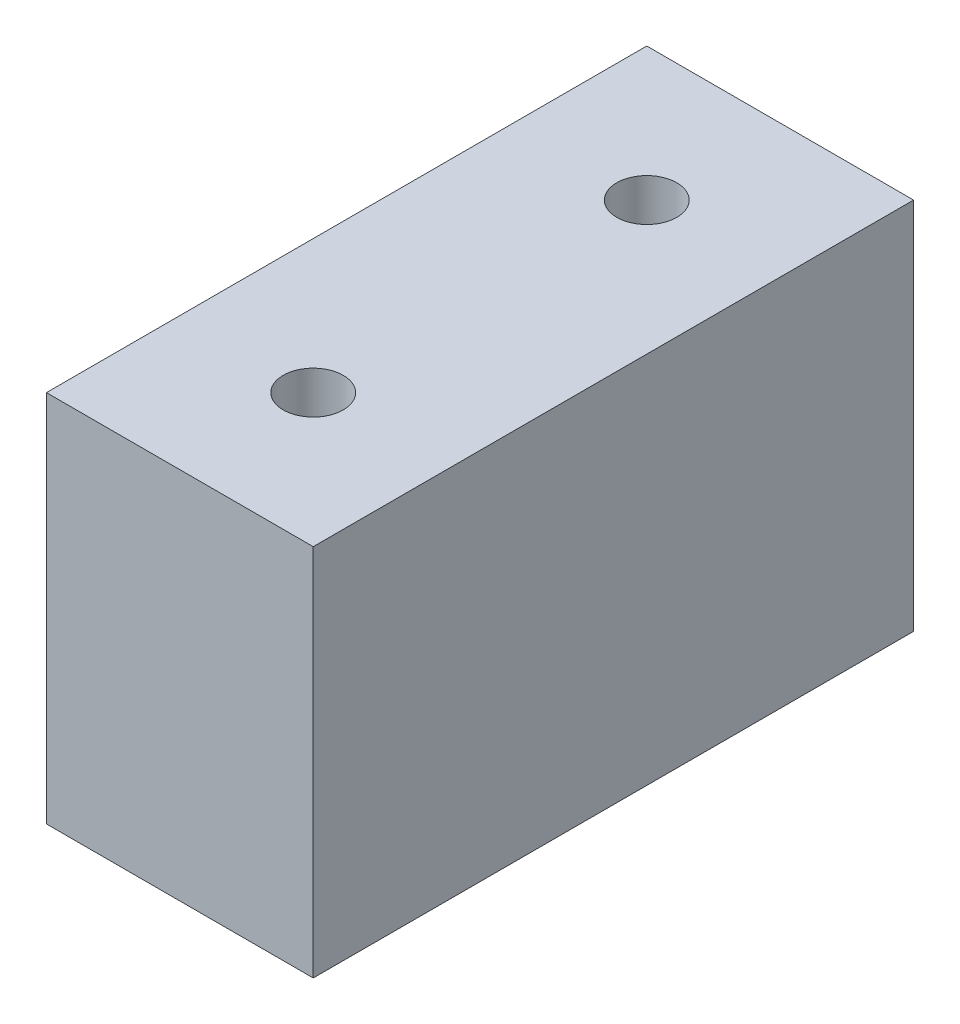
ISO-10303-21;
HEADER;
FILE_DESCRIPTION(('STEP AP214'),'2;1');
FILE_NAME('part.step','',(''),(''),'','','');
FILE_SCHEMA(('AUTOMOTIVE_DESIGN { 1 0 10303 214 1 1 1 1 }'));
ENDSEC;
DATA;
#1=APPLICATION_CONTEXT('core data for automotive mechanical design processes');
#2=APPLICATION_PROTOCOL_DEFINITION('international standard','automotive_design',2000,#1);
#3=PRODUCT_CONTEXT('',#1,'mechanical');
#4=PRODUCT('Part','Part','',(#3));
#5=PRODUCT_RELATED_PRODUCT_CATEGORY('part','',(#4));
#6=PRODUCT_DEFINITION_FORMATION('','',#4);
#7=PRODUCT_DEFINITION_CONTEXT('part definition',#1,'design');
#8=PRODUCT_DEFINITION('design','',#6,#7);
#9=PRODUCT_DEFINITION_SHAPE('','',#8);
#10=(LENGTH_UNIT() NAMED_UNIT(*) SI_UNIT(.MILLI.,.METRE.));
#11=(NAMED_UNIT(*) PLANE_ANGLE_UNIT() SI_UNIT($,.RADIAN.));
#12=(NAMED_UNIT(*) SI_UNIT($,.STERADIAN.) SOLID_ANGLE_UNIT());
#13=UNCERTAINTY_MEASURE_WITH_UNIT(LENGTH_MEASURE(1.E-05),#10,'distance_accuracy_value','');
#14=(GEOMETRIC_REPRESENTATION_CONTEXT(3) GLOBAL_UNCERTAINTY_ASSIGNED_CONTEXT((#13)) GLOBAL_UNIT_ASSIGNED_CONTEXT((#10,
#11,#12)) REPRESENTATION_CONTEXT('',''));
#15=CARTESIAN_POINT('',(0.,0.,0.));
#16=DIRECTION('',(0.,0.,1.));
#17=DIRECTION('',(1.,0.,0.));
#18=AXIS2_PLACEMENT_3D('',#15,#16,#17);
#19=CARTESIAN_POINT('',(0.,28.,0.));
#20=DIRECTION('',(0.,-1.,0.));
#21=DIRECTION('',(0.,0.,-1.));
#22=AXIS2_PLACEMENT_3D('',#19,#20,#21);
#23=PLANE('',#22);
#24=DIRECTION('',(0.,0.,1.));
#25=VECTOR('',#24,1.);
#26=CARTESIAN_POINT('',(0.,28.,0.));
#27=LINE('',#26,#25);
#28=CARTESIAN_POINT('',(0.,28.,-45.));
#29=VERTEX_POINT('',#28);
#30=CARTESIAN_POINT('',(0.,28.,0.));
#31=VERTEX_POINT('',#30);
#32=EDGE_CURVE('E91',#29,#31,#27,.T.);
#33=ORIENTED_EDGE('',*,*,#32,.T.);
#34=DIRECTION('',(1.,0.,0.));
#35=VECTOR('',#34,1.);
#36=CARTESIAN_POINT('',(0.,28.,0.));
#37=LINE('',#36,#35);
#38=CARTESIAN_POINT('',(20.,28.,0.));
#39=VERTEX_POINT('',#38);
#40=EDGE_CURVE('E86',#31,#39,#37,.T.);
#41=ORIENTED_EDGE('',*,*,#40,.T.);
#42=DIRECTION('',(0.,0.,-1.));
#43=VECTOR('',#42,1.);
#44=CARTESIAN_POINT('',(20.,28.,0.));
#45=LINE('',#44,#43);
#46=CARTESIAN_POINT('',(20.,28.,-45.));
#47=VERTEX_POINT('',#46);
#48=EDGE_CURVE('E89',#39,#47,#45,.T.);
#49=ORIENTED_EDGE('',*,*,#48,.T.);
#50=DIRECTION('',(-1.,0.,0.));
#51=VECTOR('',#50,1.);
#52=CARTESIAN_POINT('',(0.,28.,-45.));
#53=LINE('',#52,#51);
#54=EDGE_CURVE('E56',#47,#29,#53,.T.);
#55=ORIENTED_EDGE('',*,*,#54,.T.);
#56=EDGE_LOOP('',(#33,#41,#49,#55));
#57=FACE_BOUND('',#56,.T.);
#58=CARTESIAN_POINT('',(10.,28.,-35.));
#59=DIRECTION('',(0.,1.,0.));
#60=DIRECTION('',(0.,0.,1.));
#61=AXIS2_PLACEMENT_3D('',#58,#59,#60);
#62=CIRCLE('',#61,2.25);
#63=CARTESIAN_POINT('',(10.,28.,-32.75));
#64=VERTEX_POINT('',#63);
#65=EDGE_CURVE('E106',#64,#64,#62,.T.);
#66=ORIENTED_EDGE('',*,*,#65,.F.);
#67=EDGE_LOOP('',(#66));
#68=FACE_BOUND('',#67,.T.);
#69=CARTESIAN_POINT('',(10.,28.,-9.99999999999999));
#70=DIRECTION('',(0.,1.,0.));
#71=DIRECTION('',(0.,0.,-1.));
#72=AXIS2_PLACEMENT_3D('',#69,#70,#71);
#73=CIRCLE('',#72,2.25);
#74=CARTESIAN_POINT('',(10.,28.,-12.25));
#75=VERTEX_POINT('',#74);
#76=EDGE_CURVE('E121',#75,#75,#73,.T.);
#77=ORIENTED_EDGE('',*,*,#76,.F.);
#78=EDGE_LOOP('',(#77));
#79=FACE_BOUND('',#78,.T.);
#80=ADVANCED_FACE('F39',(#57,#68,#79),#23,.F.);
#81=CARTESIAN_POINT('',(0.,0.,0.));
#82=DIRECTION('',(0.,-1.,0.));
#83=DIRECTION('',(0.,0.,-1.));
#84=AXIS2_PLACEMENT_3D('',#81,#82,#83);
#85=PLANE('',#84);
#86=CARTESIAN_POINT('',(10.,0.,-35.));
#87=DIRECTION('',(0.,1.,0.));
#88=DIRECTION('',(0.,0.,1.));
#89=AXIS2_PLACEMENT_3D('',#86,#87,#88);
#90=CIRCLE('',#89,2.25);
#91=CARTESIAN_POINT('',(10.,0.,-32.75));
#92=VERTEX_POINT('',#91);
#93=EDGE_CURVE('E118',#92,#92,#90,.T.);
#94=ORIENTED_EDGE('',*,*,#93,.T.);
#95=EDGE_LOOP('',(#94));
#96=FACE_BOUND('',#95,.T.);
#97=DIRECTION('',(0.,0.,1.));
#98=VECTOR('',#97,1.);
#99=CARTESIAN_POINT('',(0.,0.,0.));
#100=LINE('',#99,#98);
#101=CARTESIAN_POINT('',(0.,0.,-45.));
#102=VERTEX_POINT('',#101);
#103=CARTESIAN_POINT('',(0.,0.,0.));
#104=VERTEX_POINT('',#103);
#105=EDGE_CURVE('E103',#102,#104,#100,.T.);
#106=ORIENTED_EDGE('',*,*,#105,.F.);
#107=DIRECTION('',(-1.,0.,0.));
#108=VECTOR('',#107,1.);
#109=CARTESIAN_POINT('',(0.,0.,-45.));
#110=LINE('',#109,#108);
#111=CARTESIAN_POINT('',(20.,0.,-45.));
#112=VERTEX_POINT('',#111);
#113=EDGE_CURVE('E79',#112,#102,#110,.T.);
#114=ORIENTED_EDGE('',*,*,#113,.F.);
#115=DIRECTION('',(0.,0.,-1.));
#116=VECTOR('',#115,1.);
#117=CARTESIAN_POINT('',(20.,0.,0.));
#118=LINE('',#117,#116);
#119=CARTESIAN_POINT('',(20.,0.,0.));
#120=VERTEX_POINT('',#119);
#121=EDGE_CURVE('E73',#120,#112,#118,.T.);
#122=ORIENTED_EDGE('',*,*,#121,.F.);
#123=DIRECTION('',(1.,0.,0.));
#124=VECTOR('',#123,1.);
#125=CARTESIAN_POINT('',(0.,0.,0.));
#126=LINE('',#125,#124);
#127=EDGE_CURVE('E95',#104,#120,#126,.T.);
#128=ORIENTED_EDGE('',*,*,#127,.F.);
#129=EDGE_LOOP('',(#106,#114,#122,#128));
#130=FACE_BOUND('',#129,.T.);
#131=CARTESIAN_POINT('',(10.,0.,-9.99999999999999));
#132=DIRECTION('',(0.,1.,0.));
#133=DIRECTION('',(0.,0.,-1.));
#134=AXIS2_PLACEMENT_3D('',#131,#132,#133);
#135=CIRCLE('',#134,2.25);
#136=CARTESIAN_POINT('',(10.,0.,-12.25));
#137=VERTEX_POINT('',#136);
#138=EDGE_CURVE('E124',#137,#137,#135,.T.);
#139=ORIENTED_EDGE('',*,*,#138,.T.);
#140=EDGE_LOOP('',(#139));
#141=FACE_BOUND('',#140,.T.);
#142=ADVANCED_FACE('F114',(#96,#130,#141),#85,.T.);
#143=CARTESIAN_POINT('',(0.,28.,0.));
#144=DIRECTION('',(1.,0.,0.));
#145=DIRECTION('',(0.,0.,-1.));
#146=AXIS2_PLACEMENT_3D('',#143,#144,#145);
#147=PLANE('',#146);
#148=ORIENTED_EDGE('',*,*,#105,.T.);
#149=DIRECTION('',(0.,-1.,0.));
#150=VECTOR('',#149,1.);
#151=CARTESIAN_POINT('',(0.,28.,0.));
#152=LINE('',#151,#150);
#153=EDGE_CURVE('E11',#31,#104,#152,.T.);
#154=ORIENTED_EDGE('',*,*,#153,.F.);
#155=ORIENTED_EDGE('',*,*,#32,.F.);
#156=DIRECTION('',(0.,-1.,0.));
#157=VECTOR('',#156,1.);
#158=CARTESIAN_POINT('',(0.,28.,-45.));
#159=LINE('',#158,#157);
#160=EDGE_CURVE('E99',#29,#102,#159,.T.);
#161=ORIENTED_EDGE('',*,*,#160,.T.);
#162=EDGE_LOOP('',(#148,#154,#155,#161));
#163=FACE_BOUND('',#162,.T.);
#164=ADVANCED_FACE('F41',(#163),#147,.F.);
#165=CARTESIAN_POINT('',(0.,28.,0.));
#166=DIRECTION('',(0.,0.,-1.));
#167=DIRECTION('',(-1.,0.,0.));
#168=AXIS2_PLACEMENT_3D('',#165,#166,#167);
#169=PLANE('',#168);
#170=ORIENTED_EDGE('',*,*,#127,.T.);
#171=DIRECTION('',(0.,-1.,0.));
#172=VECTOR('',#171,1.);
#173=CARTESIAN_POINT('',(20.,28.,0.));
#174=LINE('',#173,#172);
#175=EDGE_CURVE('E48',#39,#120,#174,.T.);
#176=ORIENTED_EDGE('',*,*,#175,.F.);
#177=ORIENTED_EDGE('',*,*,#40,.F.);
#178=ORIENTED_EDGE('',*,*,#153,.T.);
#179=EDGE_LOOP('',(#170,#176,#177,#178));
#180=FACE_BOUND('',#179,.T.);
#181=ADVANCED_FACE('F94',(#180),#169,.F.);
#182=CARTESIAN_POINT('',(20.,28.,0.));
#183=DIRECTION('',(-1.,0.,0.));
#184=DIRECTION('',(0.,0.,1.));
#185=AXIS2_PLACEMENT_3D('',#182,#183,#184);
#186=PLANE('',#185);
#187=ORIENTED_EDGE('',*,*,#121,.T.);
#188=DIRECTION('',(0.,-1.,0.));
#189=VECTOR('',#188,1.);
#190=CARTESIAN_POINT('',(20.,28.,-45.));
#191=LINE('',#190,#189);
#192=EDGE_CURVE('E96',#47,#112,#191,.T.);
#193=ORIENTED_EDGE('',*,*,#192,.F.);
#194=ORIENTED_EDGE('',*,*,#48,.F.);
#195=ORIENTED_EDGE('',*,*,#175,.T.);
#196=EDGE_LOOP('',(#187,#193,#194,#195));
#197=FACE_BOUND('',#196,.T.);
#198=ADVANCED_FACE('F97',(#197),#186,.F.);
#199=CARTESIAN_POINT('',(0.,28.,-45.));
#200=DIRECTION('',(0.,0.,1.));
#201=DIRECTION('',(1.,0.,0.));
#202=AXIS2_PLACEMENT_3D('',#199,#200,#201);
#203=PLANE('',#202);
#204=ORIENTED_EDGE('',*,*,#113,.T.);
#205=ORIENTED_EDGE('',*,*,#160,.F.);
#206=ORIENTED_EDGE('',*,*,#54,.F.);
#207=ORIENTED_EDGE('',*,*,#192,.T.);
#208=EDGE_LOOP('',(#204,#205,#206,#207));
#209=FACE_BOUND('',#208,.T.);
#210=ADVANCED_FACE('F111',(#209),#203,.F.);
#211=CARTESIAN_POINT('',(10.,28.,-35.));
#212=DIRECTION('',(0.,-1.,0.));
#213=DIRECTION('',(0.,0.,-1.));
#214=AXIS2_PLACEMENT_3D('',#211,#212,#213);
#215=CYLINDRICAL_SURFACE('',#214,2.25);
#216=ORIENTED_EDGE('',*,*,#65,.T.);
#217=EDGE_LOOP('',(#216));
#218=FACE_BOUND('',#217,.T.);
#219=ORIENTED_EDGE('',*,*,#93,.F.);
#220=EDGE_LOOP('',(#219));
#221=FACE_BOUND('',#220,.T.);
#222=ADVANCED_FACE('F141',(#218,#221),#215,.F.);
#223=CARTESIAN_POINT('',(10.,28.,-9.99999999999999));
#224=DIRECTION('',(0.,-1.,0.));
#225=DIRECTION('',(0.,0.,-1.));
#226=AXIS2_PLACEMENT_3D('',#223,#224,#225);
#227=CYLINDRICAL_SURFACE('',#226,2.25);
#228=ORIENTED_EDGE('',*,*,#76,.T.);
#229=EDGE_LOOP('',(#228));
#230=FACE_BOUND('',#229,.T.);
#231=ORIENTED_EDGE('',*,*,#138,.F.);
#232=EDGE_LOOP('',(#231));
#233=FACE_BOUND('',#232,.T.);
#234=ADVANCED_FACE('F130',(#230,#233),#227,.F.);
#235=CLOSED_SHELL('',(#80,#142,#164,#181,#198,#210,#222,#234));
#236=MANIFOLD_SOLID_BREP('B2',#235);
#237=ADVANCED_BREP_SHAPE_REPRESENTATION('',(#18,#236),#14);
#238=SHAPE_DEFINITION_REPRESENTATION(#9,#237);
ENDSEC;
END-ISO-10303-21;
